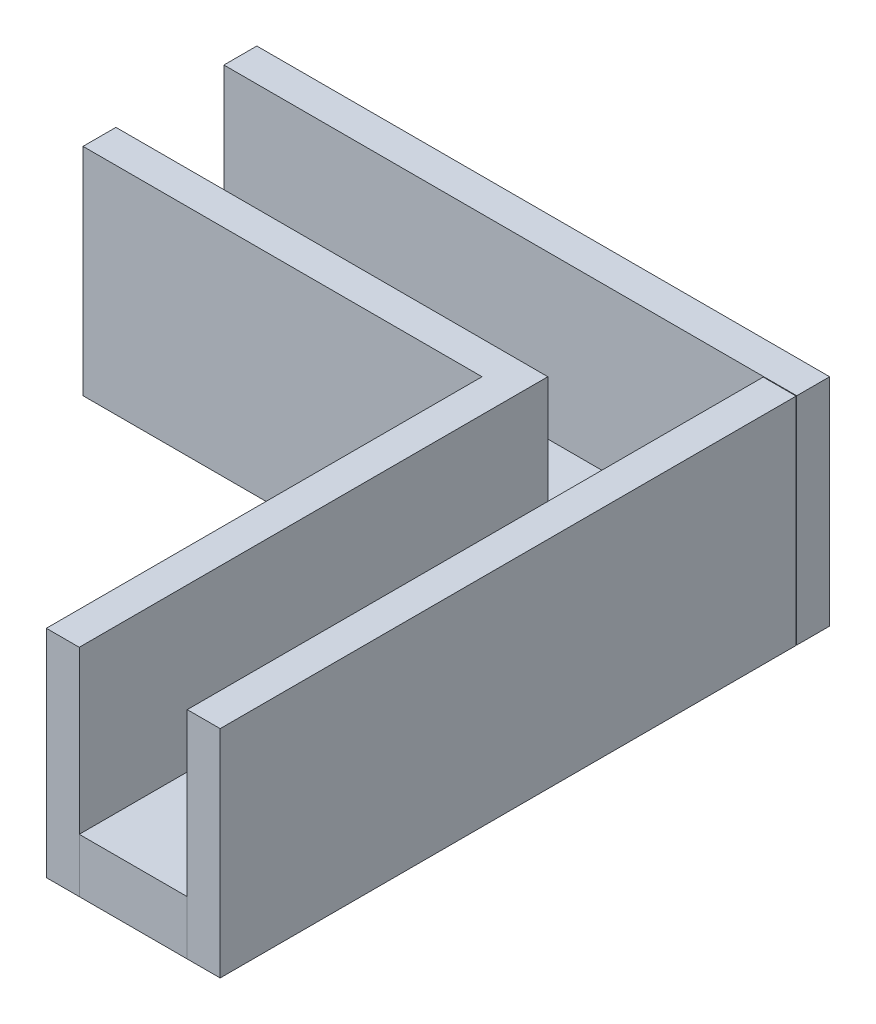
ISO-10303-21;
HEADER;
FILE_DESCRIPTION(('STEP AP214'),'2;1');
FILE_NAME('part.step','',(''),(''),'','','');
FILE_SCHEMA(('AUTOMOTIVE_DESIGN { 1 0 10303 214 1 1 1 1 }'));
ENDSEC;
DATA;
#1=APPLICATION_CONTEXT('core data for automotive mechanical design processes');
#2=APPLICATION_PROTOCOL_DEFINITION('international standard','automotive_design',2000,#1);
#3=PRODUCT_CONTEXT('',#1,'mechanical');
#4=PRODUCT('Part','Part','',(#3));
#5=PRODUCT_RELATED_PRODUCT_CATEGORY('part','',(#4));
#6=PRODUCT_DEFINITION_FORMATION('','',#4);
#7=PRODUCT_DEFINITION_CONTEXT('part definition',#1,'design');
#8=PRODUCT_DEFINITION('design','',#6,#7);
#9=PRODUCT_DEFINITION_SHAPE('','',#8);
#10=(LENGTH_UNIT() NAMED_UNIT(*) SI_UNIT(.MILLI.,.METRE.));
#11=(NAMED_UNIT(*) PLANE_ANGLE_UNIT() SI_UNIT($,.RADIAN.));
#12=(NAMED_UNIT(*) SI_UNIT($,.STERADIAN.) SOLID_ANGLE_UNIT());
#13=UNCERTAINTY_MEASURE_WITH_UNIT(LENGTH_MEASURE(1.E-05),#10,'distance_accuracy_value','');
#14=(GEOMETRIC_REPRESENTATION_CONTEXT(3) GLOBAL_UNCERTAINTY_ASSIGNED_CONTEXT((#13)) GLOBAL_UNIT_ASSIGNED_CONTEXT((#10,
#11,#12)) REPRESENTATION_CONTEXT('',''));
#15=CARTESIAN_POINT('',(0.,0.,0.));
#16=DIRECTION('',(0.,0.,1.));
#17=DIRECTION('',(1.,0.,0.));
#18=AXIS2_PLACEMENT_3D('',#15,#16,#17);
#19=CARTESIAN_POINT('',(0.,10.,0.));
#20=DIRECTION('',(0.,-1.,0.));
#21=DIRECTION('',(0.,0.,-1.));
#22=AXIS2_PLACEMENT_3D('',#19,#20,#21);
#23=PLANE('',#22);
#24=DIRECTION('',(-1.,0.,0.));
#25=VECTOR('',#24,1.);
#26=CARTESIAN_POINT('',(7.500000094,10.,24.198000038));
#27=LINE('',#26,#25);
#28=CARTESIAN_POINT('',(7.500000094,10.,24.198000038));
#29=VERTEX_POINT('',#28);
#30=CARTESIAN_POINT('',(5.976000094,10.,24.198000038));
#31=VERTEX_POINT('',#30);
#32=EDGE_CURVE('E154',#29,#31,#27,.T.);
#33=ORIENTED_EDGE('',*,*,#32,.F.);
#34=DIRECTION('',(0.,0.,1.));
#35=VECTOR('',#34,1.);
#36=CARTESIAN_POINT('',(7.500000094,10.,2.5));
#37=LINE('',#36,#35);
#38=CARTESIAN_POINT('',(7.500000094,10.,2.5));
#39=VERTEX_POINT('',#38);
#40=EDGE_CURVE('E177',#39,#29,#37,.T.);
#41=ORIENTED_EDGE('',*,*,#40,.F.);
#42=DIRECTION('',(-1.,0.,0.));
#43=VECTOR('',#42,1.);
#44=CARTESIAN_POINT('',(7.500000094,10.,2.5));
#45=LINE('',#44,#43);
#46=CARTESIAN_POINT('',(-12.5,10.,2.5));
#47=VERTEX_POINT('',#46);
#48=EDGE_CURVE('E174',#39,#47,#45,.T.);
#49=ORIENTED_EDGE('',*,*,#48,.T.);
#50=DIRECTION('',(0.,0.,1.));
#51=VECTOR('',#50,1.);
#52=CARTESIAN_POINT('',(-12.5,10.,2.5));
#53=LINE('',#52,#51);
#54=CARTESIAN_POINT('',(-12.5,10.,4.024));
#55=VERTEX_POINT('',#54);
#56=EDGE_CURVE('E146',#47,#55,#53,.T.);
#57=ORIENTED_EDGE('',*,*,#56,.T.);
#58=DIRECTION('',(-1.,0.,0.));
#59=VECTOR('',#58,1.);
#60=CARTESIAN_POINT('',(7.500000094,10.,4.024));
#61=LINE('',#60,#59);
#62=CARTESIAN_POINT('',(5.976000094,10.,4.024));
#63=VERTEX_POINT('',#62);
#64=EDGE_CURVE('E138',#63,#55,#61,.T.);
#65=ORIENTED_EDGE('',*,*,#64,.F.);
#66=DIRECTION('',(0.,0.,-1.));
#67=VECTOR('',#66,1.);
#68=CARTESIAN_POINT('',(5.976000094,10.,24.198000038));
#69=LINE('',#68,#67);
#70=EDGE_CURVE('E85',#31,#63,#69,.T.);
#71=ORIENTED_EDGE('',*,*,#70,.F.);
#72=EDGE_LOOP('',(#33,#41,#49,#57,#65,#71));
#73=FACE_BOUND('',#72,.T.);
#74=ADVANCED_FACE('F82',(#73),#23,.F.);
#75=CARTESIAN_POINT('',(7.500000094,10.,24.198000038));
#76=DIRECTION('',(0.,0.,1.));
#77=DIRECTION('',(1.,0.,0.));
#78=AXIS2_PLACEMENT_3D('',#75,#76,#77);
#79=PLANE('',#78);
#80=DIRECTION('',(-1.,0.,0.));
#81=VECTOR('',#80,1.);
#82=CARTESIAN_POINT('',(7.500000094,0.,24.198000038));
#83=LINE('',#82,#81);
#84=CARTESIAN_POINT('',(7.500000094,0.,24.198000038));
#85=VERTEX_POINT('',#84);
#86=CARTESIAN_POINT('',(5.976000094,0.,24.198000038));
#87=VERTEX_POINT('',#86);
#88=EDGE_CURVE('E153',#85,#87,#83,.T.);
#89=ORIENTED_EDGE('',*,*,#88,.F.);
#90=DIRECTION('',(0.,-1.,0.));
#91=VECTOR('',#90,1.);
#92=CARTESIAN_POINT('',(7.500000094,10.,24.198000038));
#93=LINE('',#92,#91);
#94=EDGE_CURVE('E160',#29,#85,#93,.T.);
#95=ORIENTED_EDGE('',*,*,#94,.F.);
#96=ORIENTED_EDGE('',*,*,#32,.T.);
#97=DIRECTION('',(0.,-1.,0.));
#98=VECTOR('',#97,1.);
#99=CARTESIAN_POINT('',(5.976000094,10.,24.198000038));
#100=LINE('',#99,#98);
#101=EDGE_CURVE('E131',#31,#87,#100,.T.);
#102=ORIENTED_EDGE('',*,*,#101,.T.);
#103=EDGE_LOOP('',(#89,#95,#96,#102));
#104=FACE_BOUND('',#103,.T.);
#105=ADVANCED_FACE('F209',(#104),#79,.T.);
#106=CARTESIAN_POINT('',(0.,0.,0.));
#107=DIRECTION('',(0.,-1.,0.));
#108=DIRECTION('',(0.,0.,-1.));
#109=AXIS2_PLACEMENT_3D('',#106,#107,#108);
#110=PLANE('',#109);
#111=DIRECTION('',(0.,0.,-1.));
#112=VECTOR('',#111,1.);
#113=CARTESIAN_POINT('',(5.976000094,0.,24.198000038));
#114=LINE('',#113,#112);
#115=CARTESIAN_POINT('',(5.976000094,0.,4.024));
#116=VERTEX_POINT('',#115);
#117=EDGE_CURVE('E158',#87,#116,#114,.T.);
#118=ORIENTED_EDGE('',*,*,#117,.T.);
#119=DIRECTION('',(-1.,0.,0.));
#120=VECTOR('',#119,1.);
#121=CARTESIAN_POINT('',(7.500000094,0.,4.024));
#122=LINE('',#121,#120);
#123=CARTESIAN_POINT('',(-12.5,0.,4.024));
#124=VERTEX_POINT('',#123);
#125=EDGE_CURVE('E13',#116,#124,#122,.T.);
#126=ORIENTED_EDGE('',*,*,#125,.T.);
#127=DIRECTION('',(0.,0.,1.));
#128=VECTOR('',#127,1.);
#129=CARTESIAN_POINT('',(-12.5,0.,2.5));
#130=LINE('',#129,#128);
#131=CARTESIAN_POINT('',(-12.5,0.,2.5));
#132=VERTEX_POINT('',#131);
#133=EDGE_CURVE('E92',#132,#124,#130,.T.);
#134=ORIENTED_EDGE('',*,*,#133,.F.);
#135=DIRECTION('',(-1.,0.,0.));
#136=VECTOR('',#135,1.);
#137=CARTESIAN_POINT('',(7.500000094,0.,2.5));
#138=LINE('',#137,#136);
#139=CARTESIAN_POINT('',(7.500000094,0.,2.5));
#140=VERTEX_POINT('',#139);
#141=EDGE_CURVE('E184',#140,#132,#138,.T.);
#142=ORIENTED_EDGE('',*,*,#141,.F.);
#143=DIRECTION('',(0.,0.,1.));
#144=VECTOR('',#143,1.);
#145=CARTESIAN_POINT('',(7.500000094,0.,2.5));
#146=LINE('',#145,#144);
#147=EDGE_CURVE('E149',#140,#85,#146,.T.);
#148=ORIENTED_EDGE('',*,*,#147,.T.);
#149=ORIENTED_EDGE('',*,*,#88,.T.);
#150=EDGE_LOOP('',(#118,#126,#134,#142,#148,#149));
#151=FACE_BOUND('',#150,.T.);
#152=ADVANCED_FACE('F201',(#151),#110,.T.);
#153=CARTESIAN_POINT('',(5.976000094,10.,24.198000038));
#154=DIRECTION('',(-1.,0.,0.));
#155=DIRECTION('',(0.,0.,1.));
#156=AXIS2_PLACEMENT_3D('',#153,#154,#155);
#157=PLANE('',#156);
#158=ORIENTED_EDGE('',*,*,#117,.F.);
#159=ORIENTED_EDGE('',*,*,#101,.F.);
#160=ORIENTED_EDGE('',*,*,#70,.T.);
#161=DIRECTION('',(0.,-1.,0.));
#162=VECTOR('',#161,1.);
#163=CARTESIAN_POINT('',(5.976000094,10.,4.024));
#164=LINE('',#163,#162);
#165=EDGE_CURVE('E135',#63,#116,#164,.T.);
#166=ORIENTED_EDGE('',*,*,#165,.T.);
#167=EDGE_LOOP('',(#158,#159,#160,#166));
#168=FACE_BOUND('',#167,.T.);
#169=ADVANCED_FACE('F151',(#168),#157,.T.);
#170=CARTESIAN_POINT('',(7.500000094,10.,24.198000038));
#171=DIRECTION('',(-1.,0.,0.));
#172=DIRECTION('',(0.,0.,1.));
#173=AXIS2_PLACEMENT_3D('',#170,#171,#172);
#174=PLANE('',#173);
#175=ORIENTED_EDGE('',*,*,#94,.T.);
#176=ORIENTED_EDGE('',*,*,#147,.F.);
#177=DIRECTION('',(0.,-1.,0.));
#178=VECTOR('',#177,1.);
#179=CARTESIAN_POINT('',(7.500000094,10.,2.5));
#180=LINE('',#179,#178);
#181=EDGE_CURVE('E168',#39,#140,#180,.T.);
#182=ORIENTED_EDGE('',*,*,#181,.F.);
#183=ORIENTED_EDGE('',*,*,#40,.T.);
#184=EDGE_LOOP('',(#175,#176,#182,#183));
#185=FACE_BOUND('',#184,.T.);
#186=ADVANCED_FACE('F205',(#185),#174,.F.);
#187=CARTESIAN_POINT('',(7.500000094,10.,2.5));
#188=DIRECTION('',(0.,0.,1.));
#189=DIRECTION('',(1.,0.,0.));
#190=AXIS2_PLACEMENT_3D('',#187,#188,#189);
#191=PLANE('',#190);
#192=ORIENTED_EDGE('',*,*,#141,.T.);
#193=DIRECTION('',(0.,-1.,0.));
#194=VECTOR('',#193,1.);
#195=CARTESIAN_POINT('',(-12.5,10.,2.5));
#196=LINE('',#195,#194);
#197=EDGE_CURVE('E192',#47,#132,#196,.T.);
#198=ORIENTED_EDGE('',*,*,#197,.F.);
#199=ORIENTED_EDGE('',*,*,#48,.F.);
#200=ORIENTED_EDGE('',*,*,#181,.T.);
#201=EDGE_LOOP('',(#192,#198,#199,#200));
#202=FACE_BOUND('',#201,.T.);
#203=ADVANCED_FACE('F220',(#202),#191,.F.);
#204=CARTESIAN_POINT('',(-12.5,10.,2.5));
#205=DIRECTION('',(1.,0.,0.));
#206=DIRECTION('',(0.,0.,-1.));
#207=AXIS2_PLACEMENT_3D('',#204,#205,#206);
#208=PLANE('',#207);
#209=ORIENTED_EDGE('',*,*,#133,.T.);
#210=DIRECTION('',(0.,-1.,0.));
#211=VECTOR('',#210,1.);
#212=CARTESIAN_POINT('',(-12.5,10.,4.024));
#213=LINE('',#212,#211);
#214=EDGE_CURVE('E179',#55,#124,#213,.T.);
#215=ORIENTED_EDGE('',*,*,#214,.F.);
#216=ORIENTED_EDGE('',*,*,#56,.F.);
#217=ORIENTED_EDGE('',*,*,#197,.T.);
#218=EDGE_LOOP('',(#209,#215,#216,#217));
#219=FACE_BOUND('',#218,.T.);
#220=ADVANCED_FACE('F198',(#219),#208,.F.);
#221=CARTESIAN_POINT('',(7.500000094,10.,4.024));
#222=DIRECTION('',(0.,0.,1.));
#223=DIRECTION('',(1.,0.,0.));
#224=AXIS2_PLACEMENT_3D('',#221,#222,#223);
#225=PLANE('',#224);
#226=ORIENTED_EDGE('',*,*,#165,.F.);
#227=ORIENTED_EDGE('',*,*,#64,.T.);
#228=ORIENTED_EDGE('',*,*,#214,.T.);
#229=ORIENTED_EDGE('',*,*,#125,.F.);
#230=EDGE_LOOP('',(#226,#227,#228,#229));
#231=FACE_BOUND('',#230,.T.);
#232=ADVANCED_FACE('F137',(#231),#225,.T.);
#233=CLOSED_SHELL('',(#74,#105,#152,#169,#186,#203,#220,#232));
#234=MANIFOLD_SOLID_BREP('B2',#233);
#235=CARTESIAN_POINT('',(-12.5,10.,-2.5));
#236=DIRECTION('',(-1.,0.,0.));
#237=DIRECTION('',(0.,0.,1.));
#238=AXIS2_PLACEMENT_3D('',#235,#236,#237);
#239=PLANE('',#238);
#240=DIRECTION('',(0.,0.,-1.));
#241=VECTOR('',#240,1.);
#242=CARTESIAN_POINT('',(-12.5,0.,-2.5));
#243=LINE('',#242,#241);
#244=CARTESIAN_POINT('',(-12.5,0.,-2.5));
#245=VERTEX_POINT('',#244);
#246=CARTESIAN_POINT('',(-12.5,0.,-4.024));
#247=VERTEX_POINT('',#246);
#248=EDGE_CURVE('E80',#245,#247,#243,.T.);
#249=ORIENTED_EDGE('',*,*,#248,.F.);
#250=DIRECTION('',(0.,-1.,0.));
#251=VECTOR('',#250,1.);
#252=CARTESIAN_POINT('',(-12.5,10.,-2.5));
#253=LINE('',#252,#251);
#254=CARTESIAN_POINT('',(-12.5,10.,-2.5));
#255=VERTEX_POINT('',#254);
#256=EDGE_CURVE('E357',#255,#245,#253,.T.);
#257=ORIENTED_EDGE('',*,*,#256,.F.);
#258=DIRECTION('',(0.,0.,-1.));
#259=VECTOR('',#258,1.);
#260=CARTESIAN_POINT('',(-12.5,10.,-2.5));
#261=LINE('',#260,#259);
#262=CARTESIAN_POINT('',(-12.5,10.,-4.024));
#263=VERTEX_POINT('',#262);
#264=EDGE_CURVE('E315',#255,#263,#261,.T.);
#265=ORIENTED_EDGE('',*,*,#264,.T.);
#266=DIRECTION('',(0.,-1.,0.));
#267=VECTOR('',#266,1.);
#268=CARTESIAN_POINT('',(-12.5,10.,-4.024));
#269=LINE('',#268,#267);
#270=EDGE_CURVE('E330',#263,#247,#269,.T.);
#271=ORIENTED_EDGE('',*,*,#270,.T.);
#272=EDGE_LOOP('',(#249,#257,#265,#271));
#273=FACE_BOUND('',#272,.T.);
#274=ADVANCED_FACE('F311',(#273),#239,.T.);
#275=CARTESIAN_POINT('',(-12.5,10.,-2.5));
#276=DIRECTION('',(0.,0.,-1.));
#277=DIRECTION('',(-1.,0.,0.));
#278=AXIS2_PLACEMENT_3D('',#275,#276,#277);
#279=PLANE('',#278);
#280=DIRECTION('',(1.,0.,0.));
#281=VECTOR('',#280,1.);
#282=CARTESIAN_POINT('',(-12.5,0.,-2.5));
#283=LINE('',#282,#281);
#284=CARTESIAN_POINT('',(14.024,0.,-2.5));
#285=VERTEX_POINT('',#284);
#286=EDGE_CURVE('E360',#245,#285,#283,.T.);
#287=ORIENTED_EDGE('',*,*,#286,.T.);
#288=DIRECTION('',(0.,-1.,0.));
#289=VECTOR('',#288,1.);
#290=CARTESIAN_POINT('',(14.024,10.,-2.5));
#291=LINE('',#290,#289);
#292=CARTESIAN_POINT('',(14.024,10.,-2.5));
#293=VERTEX_POINT('',#292);
#294=EDGE_CURVE('E363',#293,#285,#291,.T.);
#295=ORIENTED_EDGE('',*,*,#294,.F.);
#296=DIRECTION('',(1.,0.,0.));
#297=VECTOR('',#296,1.);
#298=CARTESIAN_POINT('',(-12.5,10.,-2.5));
#299=LINE('',#298,#297);
#300=EDGE_CURVE('E379',#255,#293,#299,.T.);
#301=ORIENTED_EDGE('',*,*,#300,.F.);
#302=ORIENTED_EDGE('',*,*,#256,.T.);
#303=EDGE_LOOP('',(#287,#295,#301,#302));
#304=FACE_BOUND('',#303,.T.);
#305=ADVANCED_FACE('F362',(#304),#279,.F.);
#306=CARTESIAN_POINT('',(14.024,10.,-2.5));
#307=DIRECTION('',(-1.,0.,0.));
#308=DIRECTION('',(0.,0.,1.));
#309=AXIS2_PLACEMENT_3D('',#306,#307,#308);
#310=PLANE('',#309);
#311=DIRECTION('',(0.,0.,-1.));
#312=VECTOR('',#311,1.);
#313=CARTESIAN_POINT('',(14.024,0.,-2.5));
#314=LINE('',#313,#312);
#315=CARTESIAN_POINT('',(14.024,0.,-4.024));
#316=VERTEX_POINT('',#315);
#317=EDGE_CURVE('E366',#285,#316,#314,.T.);
#318=ORIENTED_EDGE('',*,*,#317,.T.);
#319=DIRECTION('',(0.,-1.,0.));
#320=VECTOR('',#319,1.);
#321=CARTESIAN_POINT('',(14.024,10.,-4.024));
#322=LINE('',#321,#320);
#323=CARTESIAN_POINT('',(14.024,10.,-4.024));
#324=VERTEX_POINT('',#323);
#325=EDGE_CURVE('E372',#324,#316,#322,.T.);
#326=ORIENTED_EDGE('',*,*,#325,.F.);
#327=DIRECTION('',(0.,0.,-1.));
#328=VECTOR('',#327,1.);
#329=CARTESIAN_POINT('',(14.024,10.,-2.5));
#330=LINE('',#329,#328);
#331=EDGE_CURVE('E347',#293,#324,#330,.T.);
#332=ORIENTED_EDGE('',*,*,#331,.F.);
#333=ORIENTED_EDGE('',*,*,#294,.T.);
#334=EDGE_LOOP('',(#318,#326,#332,#333));
#335=FACE_BOUND('',#334,.T.);
#336=ADVANCED_FACE('F370',(#335),#310,.F.);
#337=CARTESIAN_POINT('',(-12.5,10.,-4.024));
#338=DIRECTION('',(0.,0.,-1.));
#339=DIRECTION('',(-1.,0.,0.));
#340=AXIS2_PLACEMENT_3D('',#337,#338,#339);
#341=PLANE('',#340);
#342=DIRECTION('',(1.,0.,0.));
#343=VECTOR('',#342,1.);
#344=CARTESIAN_POINT('',(-12.5,0.,-4.024));
#345=LINE('',#344,#343);
#346=EDGE_CURVE('E321',#247,#316,#345,.T.);
#347=ORIENTED_EDGE('',*,*,#346,.F.);
#348=ORIENTED_EDGE('',*,*,#270,.F.);
#349=DIRECTION('',(1.,0.,0.));
#350=VECTOR('',#349,1.);
#351=CARTESIAN_POINT('',(-12.5,10.,-4.024));
#352=LINE('',#351,#350);
#353=EDGE_CURVE('E381',#263,#324,#352,.T.);
#354=ORIENTED_EDGE('',*,*,#353,.T.);
#355=ORIENTED_EDGE('',*,*,#325,.T.);
#356=EDGE_LOOP('',(#347,#348,#354,#355));
#357=FACE_BOUND('',#356,.T.);
#358=ADVANCED_FACE('F384',(#357),#341,.T.);
#359=CARTESIAN_POINT('',(0.,10.,0.));
#360=DIRECTION('',(0.,-1.,0.));
#361=DIRECTION('',(0.,0.,-1.));
#362=AXIS2_PLACEMENT_3D('',#359,#360,#361);
#363=PLANE('',#362);
#364=ORIENTED_EDGE('',*,*,#264,.F.);
#365=ORIENTED_EDGE('',*,*,#300,.T.);
#366=ORIENTED_EDGE('',*,*,#331,.T.);
#367=ORIENTED_EDGE('',*,*,#353,.F.);
#368=EDGE_LOOP('',(#364,#365,#366,#367));
#369=FACE_BOUND('',#368,.T.);
#370=ADVANCED_FACE('F313',(#369),#363,.F.);
#371=CARTESIAN_POINT('',(0.,0.,0.));
#372=DIRECTION('',(0.,-1.,0.));
#373=DIRECTION('',(0.,0.,-1.));
#374=AXIS2_PLACEMENT_3D('',#371,#372,#373);
#375=PLANE('',#374);
#376=ORIENTED_EDGE('',*,*,#248,.T.);
#377=ORIENTED_EDGE('',*,*,#346,.T.);
#378=ORIENTED_EDGE('',*,*,#317,.F.);
#379=ORIENTED_EDGE('',*,*,#286,.F.);
#380=EDGE_LOOP('',(#376,#377,#378,#379));
#381=FACE_BOUND('',#380,.T.);
#382=ADVANCED_FACE('F374',(#381),#375,.T.);
#383=CLOSED_SHELL('',(#274,#305,#336,#358,#370,#382));
#384=MANIFOLD_SOLID_BREP('B7',#383);
#385=CARTESIAN_POINT('',(12.5,10.,24.198000038));
#386=DIRECTION('',(-1.,0.,0.));
#387=DIRECTION('',(0.,0.,1.));
#388=AXIS2_PLACEMENT_3D('',#385,#386,#387);
#389=PLANE('',#388);
#390=DIRECTION('',(0.,0.,-1.));
#391=VECTOR('',#390,1.);
#392=CARTESIAN_POINT('',(12.5,0.,24.198000038));
#393=LINE('',#392,#391);
#394=CARTESIAN_POINT('',(12.5,0.,24.198000038));
#395=VERTEX_POINT('',#394);
#396=CARTESIAN_POINT('',(12.5,0.,-2.471999962));
#397=VERTEX_POINT('',#396);
#398=EDGE_CURVE('E521',#395,#397,#393,.T.);
#399=ORIENTED_EDGE('',*,*,#398,.F.);
#400=DIRECTION('',(0.,-1.,0.));
#401=VECTOR('',#400,1.);
#402=CARTESIAN_POINT('',(12.5,10.,24.198000038));
#403=LINE('',#402,#401);
#404=CARTESIAN_POINT('',(12.5,10.,24.198000038));
#405=VERTEX_POINT('',#404);
#406=EDGE_CURVE('E309',#405,#395,#403,.T.);
#407=ORIENTED_EDGE('',*,*,#406,.F.);
#408=DIRECTION('',(0.,0.,-1.));
#409=VECTOR('',#408,1.);
#410=CARTESIAN_POINT('',(12.5,10.,24.198000038));
#411=LINE('',#410,#409);
#412=CARTESIAN_POINT('',(12.5,10.,-2.471999962));
#413=VERTEX_POINT('',#412);
#414=EDGE_CURVE('E516',#405,#413,#411,.T.);
#415=ORIENTED_EDGE('',*,*,#414,.T.);
#416=DIRECTION('',(0.,-1.,0.));
#417=VECTOR('',#416,1.);
#418=CARTESIAN_POINT('',(12.5,10.,-2.471999962));
#419=LINE('',#418,#417);
#420=EDGE_CURVE('E459',#413,#397,#419,.T.);
#421=ORIENTED_EDGE('',*,*,#420,.T.);
#422=EDGE_LOOP('',(#399,#407,#415,#421));
#423=FACE_BOUND('',#422,.T.);
#424=ADVANCED_FACE('F456',(#423),#389,.T.);
#425=CARTESIAN_POINT('',(12.5,10.,24.198000038));
#426=DIRECTION('',(0.,0.,-1.));
#427=DIRECTION('',(-1.,0.,0.));
#428=AXIS2_PLACEMENT_3D('',#425,#426,#427);
#429=PLANE('',#428);
#430=DIRECTION('',(1.,0.,0.));
#431=VECTOR('',#430,1.);
#432=CARTESIAN_POINT('',(12.5,0.,24.198000038));
#433=LINE('',#432,#431);
#434=CARTESIAN_POINT('',(14.024,0.,24.198000038));
#435=VERTEX_POINT('',#434);
#436=EDGE_CURVE('E489',#395,#435,#433,.T.);
#437=ORIENTED_EDGE('',*,*,#436,.T.);
#438=DIRECTION('',(0.,-1.,0.));
#439=VECTOR('',#438,1.);
#440=CARTESIAN_POINT('',(14.024,10.,24.198000038));
#441=LINE('',#440,#439);
#442=CARTESIAN_POINT('',(14.024,10.,24.198000038));
#443=VERTEX_POINT('',#442);
#444=EDGE_CURVE('E465',#443,#435,#441,.T.);
#445=ORIENTED_EDGE('',*,*,#444,.F.);
#446=DIRECTION('',(1.,0.,0.));
#447=VECTOR('',#446,1.);
#448=CARTESIAN_POINT('',(12.5,10.,24.198000038));
#449=LINE('',#448,#447);
#450=EDGE_CURVE('E506',#405,#443,#449,.T.);
#451=ORIENTED_EDGE('',*,*,#450,.F.);
#452=ORIENTED_EDGE('',*,*,#406,.T.);
#453=EDGE_LOOP('',(#437,#445,#451,#452));
#454=FACE_BOUND('',#453,.T.);
#455=ADVANCED_FACE('F531',(#454),#429,.F.);
#456=CARTESIAN_POINT('',(14.024,10.,24.198000038));
#457=DIRECTION('',(-1.,0.,0.));
#458=DIRECTION('',(0.,0.,1.));
#459=AXIS2_PLACEMENT_3D('',#456,#457,#458);
#460=PLANE('',#459);
#461=DIRECTION('',(0.,0.,-1.));
#462=VECTOR('',#461,1.);
#463=CARTESIAN_POINT('',(14.024,0.,24.198000038));
#464=LINE('',#463,#462);
#465=CARTESIAN_POINT('',(14.024,0.,-2.471999962));
#466=VERTEX_POINT('',#465);
#467=EDGE_CURVE('E513',#435,#466,#464,.T.);
#468=ORIENTED_EDGE('',*,*,#467,.T.);
#469=DIRECTION('',(0.,-1.,0.));
#470=VECTOR('',#469,1.);
#471=CARTESIAN_POINT('',(14.024,10.,-2.471999962));
#472=LINE('',#471,#470);
#473=CARTESIAN_POINT('',(14.024,10.,-2.471999962));
#474=VERTEX_POINT('',#473);
#475=EDGE_CURVE('E510',#474,#466,#472,.T.);
#476=ORIENTED_EDGE('',*,*,#475,.F.);
#477=DIRECTION('',(0.,0.,-1.));
#478=VECTOR('',#477,1.);
#479=CARTESIAN_POINT('',(14.024,10.,24.198000038));
#480=LINE('',#479,#478);
#481=EDGE_CURVE('E501',#443,#474,#480,.T.);
#482=ORIENTED_EDGE('',*,*,#481,.F.);
#483=ORIENTED_EDGE('',*,*,#444,.T.);
#484=EDGE_LOOP('',(#468,#476,#482,#483));
#485=FACE_BOUND('',#484,.T.);
#486=ADVANCED_FACE('F511',(#485),#460,.F.);
#487=CARTESIAN_POINT('',(12.5,10.,-2.471999962));
#488=DIRECTION('',(0.,0.,-1.));
#489=DIRECTION('',(-1.,0.,0.));
#490=AXIS2_PLACEMENT_3D('',#487,#488,#489);
#491=PLANE('',#490);
#492=DIRECTION('',(1.,0.,0.));
#493=VECTOR('',#492,1.);
#494=CARTESIAN_POINT('',(12.5,0.,-2.471999962));
#495=LINE('',#494,#493);
#496=EDGE_CURVE('E524',#397,#466,#495,.T.);
#497=ORIENTED_EDGE('',*,*,#496,.F.);
#498=ORIENTED_EDGE('',*,*,#420,.F.);
#499=DIRECTION('',(1.,0.,0.));
#500=VECTOR('',#499,1.);
#501=CARTESIAN_POINT('',(12.5,10.,-2.471999962));
#502=LINE('',#501,#500);
#503=EDGE_CURVE('E505',#413,#474,#502,.T.);
#504=ORIENTED_EDGE('',*,*,#503,.T.);
#505=ORIENTED_EDGE('',*,*,#475,.T.);
#506=EDGE_LOOP('',(#497,#498,#504,#505));
#507=FACE_BOUND('',#506,.T.);
#508=ADVANCED_FACE('F515',(#507),#491,.T.);
#509=CARTESIAN_POINT('',(0.,10.,0.));
#510=DIRECTION('',(0.,-1.,0.));
#511=DIRECTION('',(0.,0.,-1.));
#512=AXIS2_PLACEMENT_3D('',#509,#510,#511);
#513=PLANE('',#512);
#514=ORIENTED_EDGE('',*,*,#414,.F.);
#515=ORIENTED_EDGE('',*,*,#450,.T.);
#516=ORIENTED_EDGE('',*,*,#481,.T.);
#517=ORIENTED_EDGE('',*,*,#503,.F.);
#518=EDGE_LOOP('',(#514,#515,#516,#517));
#519=FACE_BOUND('',#518,.T.);
#520=ADVANCED_FACE('F504',(#519),#513,.F.);
#521=CARTESIAN_POINT('',(0.,0.,0.));
#522=DIRECTION('',(0.,-1.,0.));
#523=DIRECTION('',(0.,0.,-1.));
#524=AXIS2_PLACEMENT_3D('',#521,#522,#523);
#525=PLANE('',#524);
#526=ORIENTED_EDGE('',*,*,#398,.T.);
#527=ORIENTED_EDGE('',*,*,#496,.T.);
#528=ORIENTED_EDGE('',*,*,#467,.F.);
#529=ORIENTED_EDGE('',*,*,#436,.F.);
#530=EDGE_LOOP('',(#526,#527,#528,#529));
#531=FACE_BOUND('',#530,.T.);
#532=ADVANCED_FACE('F529',(#531),#525,.T.);
#533=CLOSED_SHELL('',(#424,#455,#486,#508,#520,#532));
#534=MANIFOLD_SOLID_BREP('B74',#533);
#535=CARTESIAN_POINT('',(12.5,2.5,0.));
#536=DIRECTION('',(1.,0.,0.));
#537=DIRECTION('',(0.,0.,-1.));
#538=AXIS2_PLACEMENT_3D('',#535,#536,#537);
#539=PLANE('',#538);
#540=DIRECTION('',(0.,0.,1.));
#541=VECTOR('',#540,1.);
#542=CARTESIAN_POINT('',(12.5,0.,0.));
#543=LINE('',#542,#541);
#544=CARTESIAN_POINT('',(12.5,0.,-2.5));
#545=VERTEX_POINT('',#544);
#546=CARTESIAN_POINT('',(12.5,0.,24.198000038));
#547=VERTEX_POINT('',#546);
#548=EDGE_CURVE('E675',#545,#547,#543,.T.);
#549=ORIENTED_EDGE('',*,*,#548,.F.);
#550=DIRECTION('',(0.,-1.,0.));
#551=VECTOR('',#550,1.);
#552=CARTESIAN_POINT('',(12.5,2.5,-2.5));
#553=LINE('',#552,#551);
#554=CARTESIAN_POINT('',(12.5,2.5,-2.5));
#555=VERTEX_POINT('',#554);
#556=EDGE_CURVE('E454',#555,#545,#553,.T.);
#557=ORIENTED_EDGE('',*,*,#556,.F.);
#558=DIRECTION('',(0.,0.,1.));
#559=VECTOR('',#558,1.);
#560=CARTESIAN_POINT('',(12.5,2.5,0.));
#561=LINE('',#560,#559);
#562=CARTESIAN_POINT('',(12.5,2.5,24.198000038));
#563=VERTEX_POINT('',#562);
#564=EDGE_CURVE('E689',#555,#563,#561,.T.);
#565=ORIENTED_EDGE('',*,*,#564,.T.);
#566=DIRECTION('',(0.,-1.,0.));
#567=VECTOR('',#566,1.);
#568=CARTESIAN_POINT('',(12.5,2.5,24.198000038));
#569=LINE('',#568,#567);
#570=EDGE_CURVE('E608',#563,#547,#569,.T.);
#571=ORIENTED_EDGE('',*,*,#570,.T.);
#572=EDGE_LOOP('',(#549,#557,#565,#571));
#573=FACE_BOUND('',#572,.T.);
#574=ADVANCED_FACE('F592',(#573),#539,.T.);
#575=CARTESIAN_POINT('',(0.,2.5,-2.5));
#576=DIRECTION('',(0.,0.,-1.));
#577=DIRECTION('',(-1.,0.,0.));
#578=AXIS2_PLACEMENT_3D('',#575,#576,#577);
#579=PLANE('',#578);
#580=DIRECTION('',(1.,0.,0.));
#581=VECTOR('',#580,1.);
#582=CARTESIAN_POINT('',(0.,0.,-2.5));
#583=LINE('',#582,#581);
#584=CARTESIAN_POINT('',(-12.5,0.,-2.5));
#585=VERTEX_POINT('',#584);
#586=EDGE_CURVE('E677',#585,#545,#583,.T.);
#587=ORIENTED_EDGE('',*,*,#586,.F.);
#588=DIRECTION('',(0.,-1.,0.));
#589=VECTOR('',#588,1.);
#590=CARTESIAN_POINT('',(-12.5,2.5,-2.5));
#591=LINE('',#590,#589);
#592=CARTESIAN_POINT('',(-12.5,2.5,-2.5));
#593=VERTEX_POINT('',#592);
#594=EDGE_CURVE('E600',#593,#585,#591,.T.);
#595=ORIENTED_EDGE('',*,*,#594,.F.);
#596=DIRECTION('',(1.,0.,0.));
#597=VECTOR('',#596,1.);
#598=CARTESIAN_POINT('',(0.,2.5,-2.5));
#599=LINE('',#598,#597);
#600=EDGE_CURVE('E670',#593,#555,#599,.T.);
#601=ORIENTED_EDGE('',*,*,#600,.T.);
#602=ORIENTED_EDGE('',*,*,#556,.T.);
#603=EDGE_LOOP('',(#587,#595,#601,#602));
#604=FACE_BOUND('',#603,.T.);
#605=ADVANCED_FACE('F698',(#604),#579,.T.);
#606=CARTESIAN_POINT('',(-12.5,2.5,0.));
#607=DIRECTION('',(-1.,0.,0.));
#608=DIRECTION('',(0.,0.,1.));
#609=AXIS2_PLACEMENT_3D('',#606,#607,#608);
#610=PLANE('',#609);
#611=DIRECTION('',(0.,0.,-1.));
#612=VECTOR('',#611,1.);
#613=CARTESIAN_POINT('',(-12.5,0.,0.));
#614=LINE('',#613,#612);
#615=CARTESIAN_POINT('',(-12.5,0.,2.5));
#616=VERTEX_POINT('',#615);
#617=EDGE_CURVE('E680',#616,#585,#614,.T.);
#618=ORIENTED_EDGE('',*,*,#617,.F.);
#619=DIRECTION('',(0.,-1.,0.));
#620=VECTOR('',#619,1.);
#621=CARTESIAN_POINT('',(-12.5,2.5,2.5));
#622=LINE('',#621,#620);
#623=CARTESIAN_POINT('',(-12.5,2.5,2.5));
#624=VERTEX_POINT('',#623);
#625=EDGE_CURVE('E656',#624,#616,#622,.T.);
#626=ORIENTED_EDGE('',*,*,#625,.F.);
#627=DIRECTION('',(0.,0.,-1.));
#628=VECTOR('',#627,1.);
#629=CARTESIAN_POINT('',(-12.5,2.5,0.));
#630=LINE('',#629,#628);
#631=EDGE_CURVE('E668',#624,#593,#630,.T.);
#632=ORIENTED_EDGE('',*,*,#631,.T.);
#633=ORIENTED_EDGE('',*,*,#594,.T.);
#634=EDGE_LOOP('',(#618,#626,#632,#633));
#635=FACE_BOUND('',#634,.T.);
#636=ADVANCED_FACE('F695',(#635),#610,.T.);
#637=CARTESIAN_POINT('',(0.,2.5,2.5));
#638=DIRECTION('',(0.,0.,1.));
#639=DIRECTION('',(1.,0.,0.));
#640=AXIS2_PLACEMENT_3D('',#637,#638,#639);
#641=PLANE('',#640);
#642=DIRECTION('',(-1.,0.,0.));
#643=VECTOR('',#642,1.);
#644=CARTESIAN_POINT('',(0.,0.,2.5));
#645=LINE('',#644,#643);
#646=CARTESIAN_POINT('',(7.500000094,0.,2.5));
#647=VERTEX_POINT('',#646);
#648=EDGE_CURVE('E653',#647,#616,#645,.T.);
#649=ORIENTED_EDGE('',*,*,#648,.F.);
#650=DIRECTION('',(0.,-1.,0.));
#651=VECTOR('',#650,1.);
#652=CARTESIAN_POINT('',(7.500000094,2.5,2.5));
#653=LINE('',#652,#651);
#654=CARTESIAN_POINT('',(7.500000094,2.5,2.5));
#655=VERTEX_POINT('',#654);
#656=EDGE_CURVE('E647',#655,#647,#653,.T.);
#657=ORIENTED_EDGE('',*,*,#656,.F.);
#658=DIRECTION('',(-1.,0.,0.));
#659=VECTOR('',#658,1.);
#660=CARTESIAN_POINT('',(0.,2.5,2.5));
#661=LINE('',#660,#659);
#662=EDGE_CURVE('E651',#655,#624,#661,.T.);
#663=ORIENTED_EDGE('',*,*,#662,.T.);
#664=ORIENTED_EDGE('',*,*,#625,.T.);
#665=EDGE_LOOP('',(#649,#657,#663,#664));
#666=FACE_BOUND('',#665,.T.);
#667=ADVANCED_FACE('F649',(#666),#641,.T.);
#668=CARTESIAN_POINT('',(7.500000094,2.5,0.));
#669=DIRECTION('',(1.,0.,0.));
#670=DIRECTION('',(0.,0.,-1.));
#671=AXIS2_PLACEMENT_3D('',#668,#669,#670);
#672=PLANE('',#671);
#673=DIRECTION('',(0.,0.,1.));
#674=VECTOR('',#673,1.);
#675=CARTESIAN_POINT('',(7.500000094,0.,0.));
#676=LINE('',#675,#674);
#677=CARTESIAN_POINT('',(7.500000094,0.,24.198000038));
#678=VERTEX_POINT('',#677);
#679=EDGE_CURVE('E684',#647,#678,#676,.T.);
#680=ORIENTED_EDGE('',*,*,#679,.T.);
#681=DIRECTION('',(0.,-1.,0.));
#682=VECTOR('',#681,1.);
#683=CARTESIAN_POINT('',(7.500000094,2.5,24.198000038));
#684=LINE('',#683,#682);
#685=CARTESIAN_POINT('',(7.500000094,2.5,24.198000038));
#686=VERTEX_POINT('',#685);
#687=EDGE_CURVE('E628',#686,#678,#684,.T.);
#688=ORIENTED_EDGE('',*,*,#687,.F.);
#689=DIRECTION('',(0.,0.,1.));
#690=VECTOR('',#689,1.);
#691=CARTESIAN_POINT('',(7.500000094,2.5,0.));
#692=LINE('',#691,#690);
#693=EDGE_CURVE('E658',#655,#686,#692,.T.);
#694=ORIENTED_EDGE('',*,*,#693,.F.);
#695=ORIENTED_EDGE('',*,*,#656,.T.);
#696=EDGE_LOOP('',(#680,#688,#694,#695));
#697=FACE_BOUND('',#696,.T.);
#698=ADVANCED_FACE('F659',(#697),#672,.F.);
#699=CARTESIAN_POINT('',(0.,2.5,24.198000038));
#700=DIRECTION('',(0.,0.,1.));
#701=DIRECTION('',(1.,0.,0.));
#702=AXIS2_PLACEMENT_3D('',#699,#700,#701);
#703=PLANE('',#702);
#704=DIRECTION('',(-1.,0.,0.));
#705=VECTOR('',#704,1.);
#706=CARTESIAN_POINT('',(0.,0.,24.198000038));
#707=LINE('',#706,#705);
#708=EDGE_CURVE('E686',#547,#678,#707,.T.);
#709=ORIENTED_EDGE('',*,*,#708,.F.);
#710=ORIENTED_EDGE('',*,*,#570,.F.);
#711=DIRECTION('',(-1.,0.,0.));
#712=VECTOR('',#711,1.);
#713=CARTESIAN_POINT('',(0.,2.5,24.198000038));
#714=LINE('',#713,#712);
#715=EDGE_CURVE('E662',#563,#686,#714,.T.);
#716=ORIENTED_EDGE('',*,*,#715,.T.);
#717=ORIENTED_EDGE('',*,*,#687,.T.);
#718=EDGE_LOOP('',(#709,#710,#716,#717));
#719=FACE_BOUND('',#718,.T.);
#720=ADVANCED_FACE('F701',(#719),#703,.T.);
#721=CARTESIAN_POINT('',(0.,2.5,0.));
#722=DIRECTION('',(0.,1.,0.));
#723=DIRECTION('',(0.,0.,1.));
#724=AXIS2_PLACEMENT_3D('',#721,#722,#723);
#725=PLANE('',#724);
#726=ORIENTED_EDGE('',*,*,#564,.F.);
#727=ORIENTED_EDGE('',*,*,#600,.F.);
#728=ORIENTED_EDGE('',*,*,#631,.F.);
#729=ORIENTED_EDGE('',*,*,#662,.F.);
#730=ORIENTED_EDGE('',*,*,#693,.T.);
#731=ORIENTED_EDGE('',*,*,#715,.F.);
#732=EDGE_LOOP('',(#726,#727,#728,#729,#730,#731));
#733=FACE_BOUND('',#732,.T.);
#734=ADVANCED_FACE('F665',(#733),#725,.T.);
#735=CARTESIAN_POINT('',(0.,0.,0.));
#736=DIRECTION('',(0.,1.,0.));
#737=DIRECTION('',(0.,0.,1.));
#738=AXIS2_PLACEMENT_3D('',#735,#736,#737);
#739=PLANE('',#738);
#740=ORIENTED_EDGE('',*,*,#548,.T.);
#741=ORIENTED_EDGE('',*,*,#708,.T.);
#742=ORIENTED_EDGE('',*,*,#679,.F.);
#743=ORIENTED_EDGE('',*,*,#648,.T.);
#744=ORIENTED_EDGE('',*,*,#617,.T.);
#745=ORIENTED_EDGE('',*,*,#586,.T.);
#746=EDGE_LOOP('',(#740,#741,#742,#743,#744,#745));
#747=FACE_BOUND('',#746,.T.);
#748=ADVANCED_FACE('F700',(#747),#739,.F.);
#749=CLOSED_SHELL('',(#574,#605,#636,#667,#698,#720,#734,#748));
#750=MANIFOLD_SOLID_BREP('B303',#749);
#751=ADVANCED_BREP_SHAPE_REPRESENTATION('',(#18,#234,#384,#534,#750),#14);
#752=SHAPE_DEFINITION_REPRESENTATION(#9,#751);
ENDSEC;
END-ISO-10303-21;
